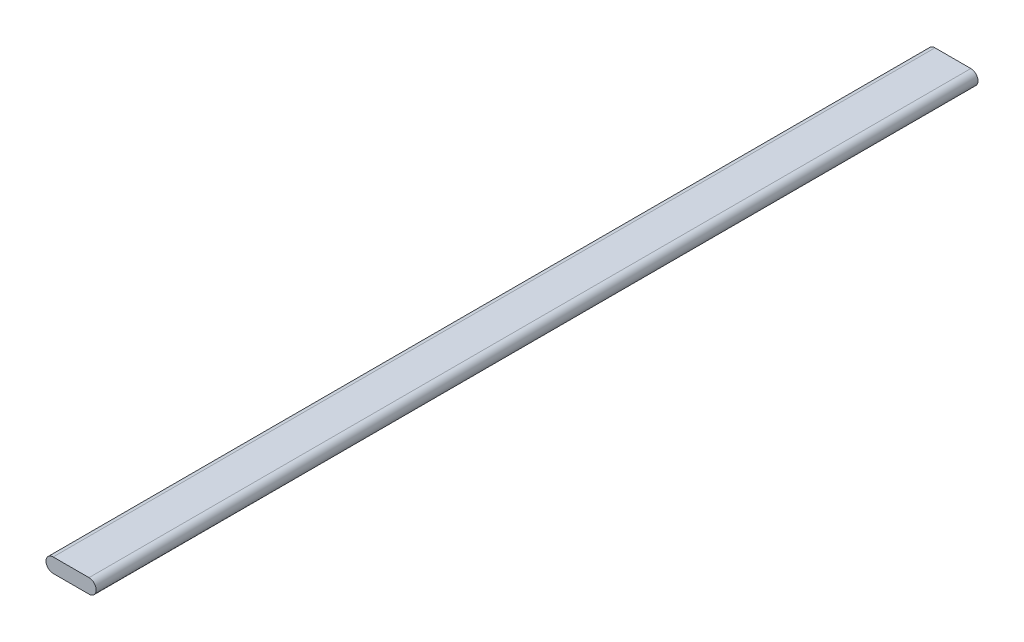
ISO-10303-21;
HEADER;
FILE_DESCRIPTION(('STEP AP214'),'2;1');
FILE_NAME('part.step','',(''),(''),'','','');
FILE_SCHEMA(('AUTOMOTIVE_DESIGN { 1 0 10303 214 1 1 1 1 }'));
ENDSEC;
DATA;
#1=APPLICATION_CONTEXT('core data for automotive mechanical design processes');
#2=APPLICATION_PROTOCOL_DEFINITION('international standard','automotive_design',2000,#1);
#3=PRODUCT_CONTEXT('',#1,'mechanical');
#4=PRODUCT('Part','Part','',(#3));
#5=PRODUCT_RELATED_PRODUCT_CATEGORY('part','',(#4));
#6=PRODUCT_DEFINITION_FORMATION('','',#4);
#7=PRODUCT_DEFINITION_CONTEXT('part definition',#1,'design');
#8=PRODUCT_DEFINITION('design','',#6,#7);
#9=PRODUCT_DEFINITION_SHAPE('','',#8);
#10=(LENGTH_UNIT() NAMED_UNIT(*) SI_UNIT(.MILLI.,.METRE.));
#11=(NAMED_UNIT(*) PLANE_ANGLE_UNIT() SI_UNIT($,.RADIAN.));
#12=(NAMED_UNIT(*) SI_UNIT($,.STERADIAN.) SOLID_ANGLE_UNIT());
#13=UNCERTAINTY_MEASURE_WITH_UNIT(LENGTH_MEASURE(1.E-05),#10,'distance_accuracy_value','');
#14=(GEOMETRIC_REPRESENTATION_CONTEXT(3) GLOBAL_UNCERTAINTY_ASSIGNED_CONTEXT((#13)) GLOBAL_UNIT_ASSIGNED_CONTEXT((#10,
#11,#12)) REPRESENTATION_CONTEXT('',''));
#15=CARTESIAN_POINT('',(0.,0.,0.));
#16=DIRECTION('',(0.,0.,1.));
#17=DIRECTION('',(1.,0.,0.));
#18=AXIS2_PLACEMENT_3D('',#15,#16,#17);
#19=CARTESIAN_POINT('',(-12.5,0.,-615.));
#20=DIRECTION('',(0.,0.,1.));
#21=DIRECTION('',(1.,0.,0.));
#22=AXIS2_PLACEMENT_3D('',#19,#20,#21);
#23=CYLINDRICAL_SURFACE('',#22,5.);
#24=CARTESIAN_POINT('',(-12.5,0.,0.));
#25=DIRECTION('',(0.,0.,1.));
#26=DIRECTION('',(1.,0.,0.));
#27=AXIS2_PLACEMENT_3D('',#24,#25,#26);
#28=CIRCLE('',#27,5.);
#29=CARTESIAN_POINT('',(-12.5,5.,0.));
#30=VERTEX_POINT('',#29);
#31=CARTESIAN_POINT('',(-12.5,-5.,0.));
#32=VERTEX_POINT('',#31);
#33=EDGE_CURVE('E113',#30,#32,#28,.T.);
#34=ORIENTED_EDGE('',*,*,#33,.F.);
#35=DIRECTION('',(0.,0.,1.));
#36=VECTOR('',#35,1.);
#37=CARTESIAN_POINT('',(-12.5,5.,-615.));
#38=LINE('',#37,#36);
#39=CARTESIAN_POINT('',(-12.5,5.,-615.));
#40=VERTEX_POINT('',#39);
#41=EDGE_CURVE('E11',#40,#30,#38,.T.);
#42=ORIENTED_EDGE('',*,*,#41,.F.);
#43=CARTESIAN_POINT('',(-12.5,0.,-615.));
#44=DIRECTION('',(0.,0.,1.));
#45=DIRECTION('',(1.,0.,0.));
#46=AXIS2_PLACEMENT_3D('',#43,#44,#45);
#47=CIRCLE('',#46,5.);
#48=CARTESIAN_POINT('',(-12.5,-5.,-615.));
#49=VERTEX_POINT('',#48);
#50=EDGE_CURVE('E104',#40,#49,#47,.T.);
#51=ORIENTED_EDGE('',*,*,#50,.T.);
#52=DIRECTION('',(0.,0.,1.));
#53=VECTOR('',#52,1.);
#54=CARTESIAN_POINT('',(-12.5,-5.,-615.));
#55=LINE('',#54,#53);
#56=EDGE_CURVE('E45',#49,#32,#55,.T.);
#57=ORIENTED_EDGE('',*,*,#56,.T.);
#58=EDGE_LOOP('',(#34,#42,#51,#57));
#59=FACE_BOUND('',#58,.T.);
#60=ADVANCED_FACE('F42',(#59),#23,.T.);
#61=CARTESIAN_POINT('',(-12.5,5.,-615.));
#62=DIRECTION('',(0.,1.,0.));
#63=DIRECTION('',(0.,0.,1.));
#64=AXIS2_PLACEMENT_3D('',#61,#62,#63);
#65=PLANE('',#64);
#66=DIRECTION('',(-1.,0.,0.));
#67=VECTOR('',#66,1.);
#68=CARTESIAN_POINT('',(-12.5,5.,0.));
#69=LINE('',#68,#67);
#70=CARTESIAN_POINT('',(12.5,5.,0.));
#71=VERTEX_POINT('',#70);
#72=EDGE_CURVE('E107',#71,#30,#69,.T.);
#73=ORIENTED_EDGE('',*,*,#72,.F.);
#74=DIRECTION('',(0.,0.,1.));
#75=VECTOR('',#74,1.);
#76=CARTESIAN_POINT('',(12.5,5.,-615.));
#77=LINE('',#76,#75);
#78=CARTESIAN_POINT('',(12.5,5.,-615.));
#79=VERTEX_POINT('',#78);
#80=EDGE_CURVE('E52',#79,#71,#77,.T.);
#81=ORIENTED_EDGE('',*,*,#80,.F.);
#82=DIRECTION('',(-1.,0.,0.));
#83=VECTOR('',#82,1.);
#84=CARTESIAN_POINT('',(-12.5,5.,-615.));
#85=LINE('',#84,#83);
#86=EDGE_CURVE('E99',#79,#40,#85,.T.);
#87=ORIENTED_EDGE('',*,*,#86,.T.);
#88=ORIENTED_EDGE('',*,*,#41,.T.);
#89=EDGE_LOOP('',(#73,#81,#87,#88));
#90=FACE_BOUND('',#89,.T.);
#91=ADVANCED_FACE('F130',(#90),#65,.T.);
#92=CARTESIAN_POINT('',(12.5,0.,-615.));
#93=DIRECTION('',(0.,0.,1.));
#94=DIRECTION('',(1.,0.,0.));
#95=AXIS2_PLACEMENT_3D('',#92,#93,#94);
#96=CYLINDRICAL_SURFACE('',#95,5.);
#97=CARTESIAN_POINT('',(12.5,0.,0.));
#98=DIRECTION('',(0.,0.,1.));
#99=DIRECTION('',(1.,0.,0.));
#100=AXIS2_PLACEMENT_3D('',#97,#98,#99);
#101=CIRCLE('',#100,5.);
#102=CARTESIAN_POINT('',(12.5,-5.,0.));
#103=VERTEX_POINT('',#102);
#104=EDGE_CURVE('E93',#103,#71,#101,.T.);
#105=ORIENTED_EDGE('',*,*,#104,.F.);
#106=DIRECTION('',(0.,0.,1.));
#107=VECTOR('',#106,1.);
#108=CARTESIAN_POINT('',(12.5,-5.,-615.));
#109=LINE('',#108,#107);
#110=CARTESIAN_POINT('',(12.5,-5.,-615.));
#111=VERTEX_POINT('',#110);
#112=EDGE_CURVE('E88',#111,#103,#109,.T.);
#113=ORIENTED_EDGE('',*,*,#112,.F.);
#114=CARTESIAN_POINT('',(12.5,0.,-615.));
#115=DIRECTION('',(0.,0.,1.));
#116=DIRECTION('',(1.,0.,0.));
#117=AXIS2_PLACEMENT_3D('',#114,#115,#116);
#118=CIRCLE('',#117,5.);
#119=EDGE_CURVE('E91',#111,#79,#118,.T.);
#120=ORIENTED_EDGE('',*,*,#119,.T.);
#121=ORIENTED_EDGE('',*,*,#80,.T.);
#122=EDGE_LOOP('',(#105,#113,#120,#121));
#123=FACE_BOUND('',#122,.T.);
#124=ADVANCED_FACE('F90',(#123),#96,.T.);
#125=CARTESIAN_POINT('',(-12.5,-5.,-615.));
#126=DIRECTION('',(0.,-1.,0.));
#127=DIRECTION('',(0.,0.,-1.));
#128=AXIS2_PLACEMENT_3D('',#125,#126,#127);
#129=PLANE('',#128);
#130=CARTESIAN_POINT('',(0.,-5.,-15.));
#131=DIRECTION('',(0.,-1.,0.));
#132=DIRECTION('',(0.,0.,-1.));
#133=AXIS2_PLACEMENT_3D('',#130,#131,#132);
#134=CIRCLE('',#133,4.);
#135=CARTESIAN_POINT('',(0.,-5.,-19.));
#136=VERTEX_POINT('',#135);
#137=EDGE_CURVE('E150',#136,#136,#134,.T.);
#138=ORIENTED_EDGE('',*,*,#137,.F.);
#139=EDGE_LOOP('',(#138));
#140=FACE_BOUND('',#139,.T.);
#141=CARTESIAN_POINT('',(0.,-5.,-600.));
#142=DIRECTION('',(0.,-1.,0.));
#143=DIRECTION('',(0.,0.,-1.));
#144=AXIS2_PLACEMENT_3D('',#141,#142,#143);
#145=CIRCLE('',#144,4.);
#146=CARTESIAN_POINT('',(0.,-5.,-604.));
#147=VERTEX_POINT('',#146);
#148=EDGE_CURVE('E153',#147,#147,#145,.T.);
#149=ORIENTED_EDGE('',*,*,#148,.F.);
#150=EDGE_LOOP('',(#149));
#151=FACE_BOUND('',#150,.T.);
#152=DIRECTION('',(1.,0.,0.));
#153=VECTOR('',#152,1.);
#154=CARTESIAN_POINT('',(-12.5,-5.,0.));
#155=LINE('',#154,#153);
#156=EDGE_CURVE('E117',#32,#103,#155,.T.);
#157=ORIENTED_EDGE('',*,*,#156,.F.);
#158=ORIENTED_EDGE('',*,*,#56,.F.);
#159=DIRECTION('',(1.,0.,0.));
#160=VECTOR('',#159,1.);
#161=CARTESIAN_POINT('',(-12.5,-5.,-615.));
#162=LINE('',#161,#160);
#163=EDGE_CURVE('E98',#49,#111,#162,.T.);
#164=ORIENTED_EDGE('',*,*,#163,.T.);
#165=ORIENTED_EDGE('',*,*,#112,.T.);
#166=EDGE_LOOP('',(#157,#158,#164,#165));
#167=FACE_BOUND('',#166,.T.);
#168=ADVANCED_FACE('F102',(#140,#151,#167),#129,.T.);
#169=CARTESIAN_POINT('',(-12.5,0.,-615.));
#170=DIRECTION('',(0.,0.,1.));
#171=DIRECTION('',(1.,0.,0.));
#172=AXIS2_PLACEMENT_3D('',#169,#170,#171);
#173=PLANE('',#172);
#174=ORIENTED_EDGE('',*,*,#50,.F.);
#175=ORIENTED_EDGE('',*,*,#86,.F.);
#176=ORIENTED_EDGE('',*,*,#119,.F.);
#177=ORIENTED_EDGE('',*,*,#163,.F.);
#178=EDGE_LOOP('',(#174,#175,#176,#177));
#179=FACE_BOUND('',#178,.T.);
#180=ADVANCED_FACE('F97',(#179),#173,.F.);
#181=CARTESIAN_POINT('',(-12.5,0.,0.));
#182=DIRECTION('',(0.,0.,1.));
#183=DIRECTION('',(1.,0.,0.));
#184=AXIS2_PLACEMENT_3D('',#181,#182,#183);
#185=PLANE('',#184);
#186=ORIENTED_EDGE('',*,*,#33,.T.);
#187=ORIENTED_EDGE('',*,*,#156,.T.);
#188=ORIENTED_EDGE('',*,*,#104,.T.);
#189=ORIENTED_EDGE('',*,*,#72,.T.);
#190=EDGE_LOOP('',(#186,#187,#188,#189));
#191=FACE_BOUND('',#190,.T.);
#192=ADVANCED_FACE('F129',(#191),#185,.T.);
#193=CARTESIAN_POINT('',(0.,0.,-600.));
#194=DIRECTION('',(0.,-1.,0.));
#195=DIRECTION('',(0.,0.,-1.));
#196=AXIS2_PLACEMENT_3D('',#193,#194,#195);
#197=CYLINDRICAL_SURFACE('',#196,4.);
#198=CARTESIAN_POINT('',(0.,0.,-600.));
#199=DIRECTION('',(0.,-1.,0.));
#200=DIRECTION('',(0.,0.,-1.));
#201=AXIS2_PLACEMENT_3D('',#198,#199,#200);
#202=CIRCLE('',#201,4.);
#203=CARTESIAN_POINT('',(0.,0.,-604.));
#204=VERTEX_POINT('',#203);
#205=EDGE_CURVE('E156',#204,#204,#202,.T.);
#206=ORIENTED_EDGE('',*,*,#205,.F.);
#207=EDGE_LOOP('',(#206));
#208=FACE_BOUND('',#207,.T.);
#209=ORIENTED_EDGE('',*,*,#148,.T.);
#210=EDGE_LOOP('',(#209));
#211=FACE_BOUND('',#210,.T.);
#212=ADVANCED_FACE('F179',(#208,#211),#197,.F.);
#213=CARTESIAN_POINT('',(0.,0.,-600.));
#214=DIRECTION('',(0.,-1.,0.));
#215=DIRECTION('',(0.,0.,-1.));
#216=AXIS2_PLACEMENT_3D('',#213,#214,#215);
#217=PLANE('',#216);
#218=ORIENTED_EDGE('',*,*,#205,.T.);
#219=EDGE_LOOP('',(#218));
#220=FACE_BOUND('',#219,.T.);
#221=ADVANCED_FACE('F172',(#220),#217,.T.);
#222=CARTESIAN_POINT('',(0.,0.,-15.));
#223=DIRECTION('',(0.,-1.,0.));
#224=DIRECTION('',(0.,0.,-1.));
#225=AXIS2_PLACEMENT_3D('',#222,#223,#224);
#226=CYLINDRICAL_SURFACE('',#225,4.);
#227=CARTESIAN_POINT('',(0.,0.,-15.));
#228=DIRECTION('',(0.,-1.,0.));
#229=DIRECTION('',(0.,0.,-1.));
#230=AXIS2_PLACEMENT_3D('',#227,#228,#229);
#231=CIRCLE('',#230,4.);
#232=CARTESIAN_POINT('',(0.,0.,-19.));
#233=VERTEX_POINT('',#232);
#234=EDGE_CURVE('E118',#233,#233,#231,.T.);
#235=ORIENTED_EDGE('',*,*,#234,.F.);
#236=EDGE_LOOP('',(#235));
#237=FACE_BOUND('',#236,.T.);
#238=ORIENTED_EDGE('',*,*,#137,.T.);
#239=EDGE_LOOP('',(#238));
#240=FACE_BOUND('',#239,.T.);
#241=ADVANCED_FACE('F169',(#237,#240),#226,.F.);
#242=CARTESIAN_POINT('',(0.,0.,-15.));
#243=DIRECTION('',(0.,-1.,0.));
#244=DIRECTION('',(0.,0.,-1.));
#245=AXIS2_PLACEMENT_3D('',#242,#243,#244);
#246=PLANE('',#245);
#247=ORIENTED_EDGE('',*,*,#234,.T.);
#248=EDGE_LOOP('',(#247));
#249=FACE_BOUND('',#248,.T.);
#250=ADVANCED_FACE('F167',(#249),#246,.T.);
#251=CLOSED_SHELL('',(#60,#91,#124,#168,#180,#192,#212,#221,#241,#250));
#252=MANIFOLD_SOLID_BREP('B2',#251);
#253=ADVANCED_BREP_SHAPE_REPRESENTATION('',(#18,#252),#14);
#254=SHAPE_DEFINITION_REPRESENTATION(#9,#253);
ENDSEC;
END-ISO-10303-21;
